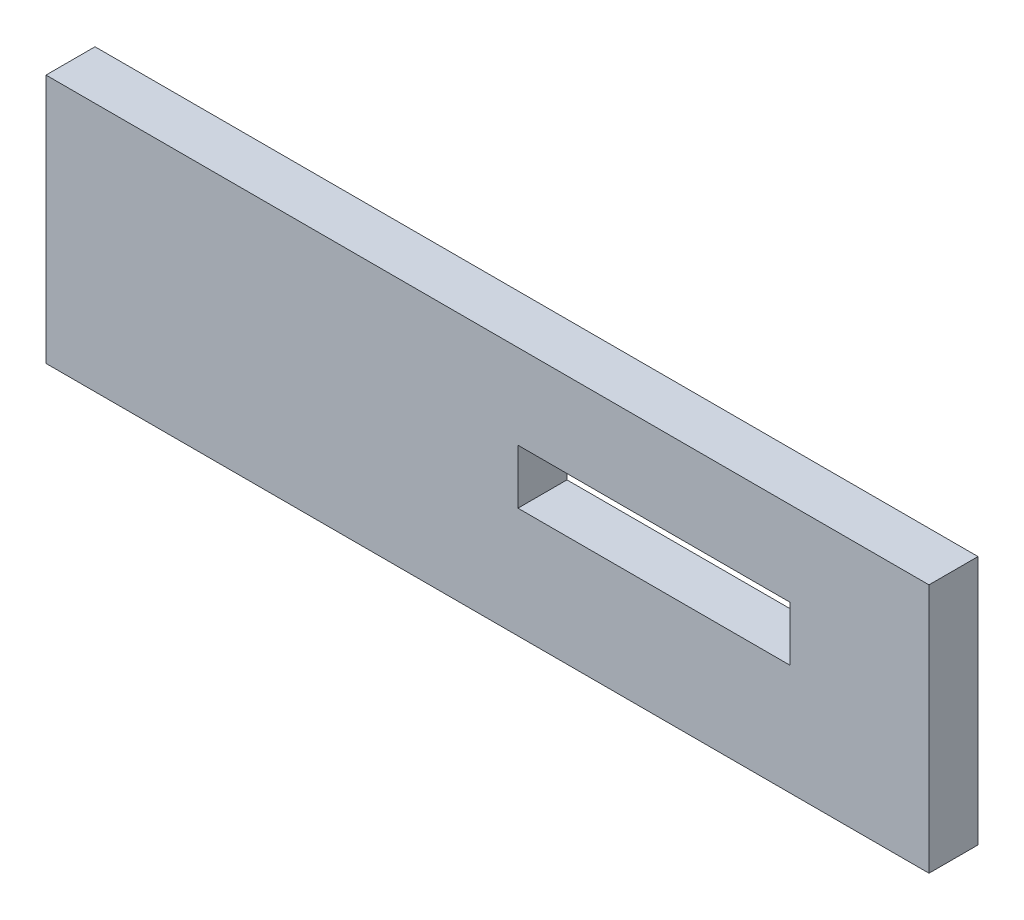
ISO-10303-21;
HEADER;
FILE_DESCRIPTION(('STEP AP214'),'2;1');
FILE_NAME('part.step','',(''),(''),'','','');
FILE_SCHEMA(('AUTOMOTIVE_DESIGN { 1 0 10303 214 1 1 1 1 }'));
ENDSEC;
DATA;
#1=APPLICATION_CONTEXT('core data for automotive mechanical design processes');
#2=APPLICATION_PROTOCOL_DEFINITION('international standard','automotive_design',2000,#1);
#3=PRODUCT_CONTEXT('',#1,'mechanical');
#4=PRODUCT('Part','Part','',(#3));
#5=PRODUCT_RELATED_PRODUCT_CATEGORY('part','',(#4));
#6=PRODUCT_DEFINITION_FORMATION('','',#4);
#7=PRODUCT_DEFINITION_CONTEXT('part definition',#1,'design');
#8=PRODUCT_DEFINITION('design','',#6,#7);
#9=PRODUCT_DEFINITION_SHAPE('','',#8);
#10=(LENGTH_UNIT() NAMED_UNIT(*) SI_UNIT(.MILLI.,.METRE.));
#11=(NAMED_UNIT(*) PLANE_ANGLE_UNIT() SI_UNIT($,.RADIAN.));
#12=(NAMED_UNIT(*) SI_UNIT($,.STERADIAN.) SOLID_ANGLE_UNIT());
#13=UNCERTAINTY_MEASURE_WITH_UNIT(LENGTH_MEASURE(1.E-05),#10,'distance_accuracy_value','');
#14=(GEOMETRIC_REPRESENTATION_CONTEXT(3) GLOBAL_UNCERTAINTY_ASSIGNED_CONTEXT((#13)) GLOBAL_UNIT_ASSIGNED_CONTEXT((#10,
#11,#12)) REPRESENTATION_CONTEXT('',''));
#15=CARTESIAN_POINT('',(0.,0.,0.));
#16=DIRECTION('',(0.,0.,1.));
#17=DIRECTION('',(1.,0.,0.));
#18=AXIS2_PLACEMENT_3D('',#15,#16,#17);
#19=CARTESIAN_POINT('',(0.,0.,0.));
#20=DIRECTION('',(0.,0.,1.));
#21=DIRECTION('',(1.,0.,0.));
#22=AXIS2_PLACEMENT_3D('',#19,#20,#21);
#23=PLANE('',#22);
#24=DIRECTION('',(1.,0.,0.));
#25=VECTOR('',#24,1.);
#26=CARTESIAN_POINT('',(0.,-1.45,0.));
#27=LINE('',#26,#25);
#28=CARTESIAN_POINT('',(-175.4419,-1.45,0.));
#29=VERTEX_POINT('',#28);
#30=CARTESIAN_POINT('',(-158.2419,-1.45,0.));
#31=VERTEX_POINT('',#30);
#32=EDGE_CURVE('E205',#29,#31,#27,.T.);
#33=ORIENTED_EDGE('',*,*,#32,.F.);
#34=DIRECTION('',(0.,-1.,0.));
#35=VECTOR('',#34,1.);
#36=CARTESIAN_POINT('',(-175.4419,0.,0.));
#37=LINE('',#36,#35);
#38=CARTESIAN_POINT('',(-175.4419,-4.9,0.));
#39=VERTEX_POINT('',#38);
#40=EDGE_CURVE('E214',#29,#39,#37,.T.);
#41=ORIENTED_EDGE('',*,*,#40,.T.);
#42=DIRECTION('',(1.,0.,0.));
#43=VECTOR('',#42,1.);
#44=CARTESIAN_POINT('',(0.,-4.9,0.));
#45=LINE('',#44,#43);
#46=CARTESIAN_POINT('',(-158.2419,-4.9,0.));
#47=VERTEX_POINT('',#46);
#48=EDGE_CURVE('E211',#39,#47,#45,.T.);
#49=ORIENTED_EDGE('',*,*,#48,.T.);
#50=DIRECTION('',(0.,-1.,0.));
#51=VECTOR('',#50,1.);
#52=CARTESIAN_POINT('',(-158.2419,0.,0.));
#53=LINE('',#52,#51);
#54=EDGE_CURVE('E208',#31,#47,#53,.T.);
#55=ORIENTED_EDGE('',*,*,#54,.F.);
#56=EDGE_LOOP('',(#33,#41,#49,#55));
#57=FACE_BOUND('',#56,.T.);
#58=CARTESIAN_POINT('',(-153.2419,-5.,0.));
#59=DIRECTION('',(0.,0.,1.));
#60=DIRECTION('',(1.,0.,0.));
#61=AXIS2_PLACEMENT_3D('',#58,#59,#60);
#62=CIRCLE('',#61,3.09999999999999);
#63=CARTESIAN_POINT('',(-150.1419,-5.,0.));
#64=VERTEX_POINT('',#63);
#65=EDGE_CURVE('E186',#64,#64,#62,.T.);
#66=ORIENTED_EDGE('',*,*,#65,.T.);
#67=EDGE_LOOP('',(#66));
#68=FACE_BOUND('',#67,.T.);
#69=CARTESIAN_POINT('',(-201.13739448131,-5.,0.));
#70=DIRECTION('',(0.,0.,1.));
#71=DIRECTION('',(1.,0.,0.));
#72=AXIS2_PLACEMENT_3D('',#69,#70,#71);
#73=CIRCLE('',#72,3.09999999999999);
#74=CARTESIAN_POINT('',(-198.03739448131,-5.,0.));
#75=VERTEX_POINT('',#74);
#76=EDGE_CURVE('E191',#75,#75,#73,.T.);
#77=ORIENTED_EDGE('',*,*,#76,.T.);
#78=EDGE_LOOP('',(#77));
#79=FACE_BOUND('',#78,.T.);
#80=DIRECTION('',(1.,0.,0.));
#81=VECTOR('',#80,1.);
#82=CARTESIAN_POINT('',(0.,-6.04928245513702,0.));
#83=LINE('',#82,#81);
#84=CARTESIAN_POINT('',(-194.74848896262,-6.049282455137,0.));
#85=VERTEX_POINT('',#84);
#86=CARTESIAN_POINT('',(-178.74848896262,-6.049282455137,0.));
#87=VERTEX_POINT('',#86);
#88=EDGE_CURVE('E159',#85,#87,#83,.T.);
#89=ORIENTED_EDGE('',*,*,#88,.T.);
#90=DIRECTION('',(0.,-1.,0.));
#91=VECTOR('',#90,1.);
#92=CARTESIAN_POINT('',(-178.74848896262,0.,0.));
#93=LINE('',#92,#91);
#94=CARTESIAN_POINT('',(-178.74848896262,0.450717544863003,0.));
#95=VERTEX_POINT('',#94);
#96=EDGE_CURVE('E167',#95,#87,#93,.T.);
#97=ORIENTED_EDGE('',*,*,#96,.F.);
#98=DIRECTION('',(1.,0.,0.));
#99=VECTOR('',#98,1.);
#100=CARTESIAN_POINT('',(0.,0.450717544863036,0.));
#101=LINE('',#100,#99);
#102=CARTESIAN_POINT('',(-194.74848896262,0.450717544863,0.));
#103=VERTEX_POINT('',#102);
#104=EDGE_CURVE('E169',#103,#95,#101,.T.);
#105=ORIENTED_EDGE('',*,*,#104,.F.);
#106=DIRECTION('',(0.,-1.,0.));
#107=VECTOR('',#106,1.);
#108=CARTESIAN_POINT('',(-194.74848896262,0.,0.));
#109=LINE('',#108,#107);
#110=EDGE_CURVE('E173',#103,#85,#109,.T.);
#111=ORIENTED_EDGE('',*,*,#110,.T.);
#112=EDGE_LOOP('',(#89,#97,#105,#111));
#113=FACE_BOUND('',#112,.T.);
#114=DIRECTION('',(-1.,0.,0.));
#115=VECTOR('',#114,1.);
#116=CARTESIAN_POINT('',(-205.29848896262,-11.9,0.));
#117=LINE('',#116,#115);
#118=CARTESIAN_POINT('',(-149.4419,-11.9,0.));
#119=VERTEX_POINT('',#118);
#120=CARTESIAN_POINT('',(-205.29848896262,-11.9,0.));
#121=VERTEX_POINT('',#120);
#122=EDGE_CURVE('E127',#119,#121,#117,.T.);
#123=ORIENTED_EDGE('',*,*,#122,.T.);
#124=DIRECTION('',(0.,1.,0.));
#125=VECTOR('',#124,1.);
#126=CARTESIAN_POINT('',(-205.29848896262,3.9,0.));
#127=LINE('',#126,#125);
#128=CARTESIAN_POINT('',(-205.29848896262,3.9,0.));
#129=VERTEX_POINT('',#128);
#130=EDGE_CURVE('E154',#121,#129,#127,.T.);
#131=ORIENTED_EDGE('',*,*,#130,.T.);
#132=DIRECTION('',(1.,0.,0.));
#133=VECTOR('',#132,1.);
#134=CARTESIAN_POINT('',(-205.29848896262,3.9,0.));
#135=LINE('',#134,#133);
#136=CARTESIAN_POINT('',(-149.4419,3.9,0.));
#137=VERTEX_POINT('',#136);
#138=EDGE_CURVE('E280',#129,#137,#135,.T.);
#139=ORIENTED_EDGE('',*,*,#138,.T.);
#140=DIRECTION('',(0.,-1.,0.));
#141=VECTOR('',#140,1.);
#142=CARTESIAN_POINT('',(-149.4419,3.9,0.));
#143=LINE('',#142,#141);
#144=EDGE_CURVE('E170',#137,#119,#143,.T.);
#145=ORIENTED_EDGE('',*,*,#144,.T.);
#146=EDGE_LOOP('',(#123,#131,#139,#145));
#147=FACE_BOUND('',#146,.T.);
#148=ADVANCED_FACE('F35',(#57,#68,#79,#113,#147),#23,.F.);
#149=CARTESIAN_POINT('',(0.,0.,3.10099735218397));
#150=DIRECTION('',(0.,0.,1.));
#151=DIRECTION('',(0.,-1.,0.));
#152=AXIS2_PLACEMENT_3D('',#149,#150,#151);
#153=PLANE('',#152);
#154=DIRECTION('',(0.,-1.,0.));
#155=VECTOR('',#154,1.);
#156=CARTESIAN_POINT('',(-175.4419,0.,3.10099735218401));
#157=LINE('',#156,#155);
#158=CARTESIAN_POINT('',(-175.4419,-1.45,3.10099735218401));
#159=VERTEX_POINT('',#158);
#160=CARTESIAN_POINT('',(-175.4419,-4.9,3.10099735218401));
#161=VERTEX_POINT('',#160);
#162=EDGE_CURVE('E11',#159,#161,#157,.T.);
#163=ORIENTED_EDGE('',*,*,#162,.F.);
#164=DIRECTION('',(1.,0.,0.));
#165=VECTOR('',#164,1.);
#166=CARTESIAN_POINT('',(0.,-1.45,3.10099735218397));
#167=LINE('',#166,#165);
#168=CARTESIAN_POINT('',(-158.2419,-1.45,3.10099735218401));
#169=VERTEX_POINT('',#168);
#170=EDGE_CURVE('E203',#159,#169,#167,.T.);
#171=ORIENTED_EDGE('',*,*,#170,.T.);
#172=DIRECTION('',(0.,-1.,0.));
#173=VECTOR('',#172,1.);
#174=CARTESIAN_POINT('',(-158.2419,0.,3.10099735218401));
#175=LINE('',#174,#173);
#176=CARTESIAN_POINT('',(-158.2419,-4.9,3.10099735218401));
#177=VERTEX_POINT('',#176);
#178=EDGE_CURVE('E201',#169,#177,#175,.T.);
#179=ORIENTED_EDGE('',*,*,#178,.T.);
#180=DIRECTION('',(1.,0.,0.));
#181=VECTOR('',#180,1.);
#182=CARTESIAN_POINT('',(0.,-4.9,3.10099735218397));
#183=LINE('',#182,#181);
#184=EDGE_CURVE('E190',#161,#177,#183,.T.);
#185=ORIENTED_EDGE('',*,*,#184,.F.);
#186=EDGE_LOOP('',(#163,#171,#179,#185));
#187=FACE_BOUND('',#186,.T.);
#188=DIRECTION('',(0.,-1.,0.));
#189=VECTOR('',#188,1.);
#190=CARTESIAN_POINT('',(-205.29848896262,3.9,3.10099735218397));
#191=LINE('',#190,#189);
#192=CARTESIAN_POINT('',(-205.29848896262,3.9,3.10099735218397));
#193=VERTEX_POINT('',#192);
#194=CARTESIAN_POINT('',(-205.29848896262,-11.9,3.10099735218403));
#195=VERTEX_POINT('',#194);
#196=EDGE_CURVE('E144',#193,#195,#191,.T.);
#197=ORIENTED_EDGE('',*,*,#196,.T.);
#198=DIRECTION('',(1.,0.,0.));
#199=VECTOR('',#198,1.);
#200=CARTESIAN_POINT('',(-205.29848896262,-11.9,3.10099735218397));
#201=LINE('',#200,#199);
#202=CARTESIAN_POINT('',(-149.4419,-11.9,3.10099735218397));
#203=VERTEX_POINT('',#202);
#204=EDGE_CURVE('E58',#195,#203,#201,.T.);
#205=ORIENTED_EDGE('',*,*,#204,.T.);
#206=DIRECTION('',(0.,1.,0.));
#207=VECTOR('',#206,1.);
#208=CARTESIAN_POINT('',(-149.4419,3.9,3.10099735218397));
#209=LINE('',#208,#207);
#210=CARTESIAN_POINT('',(-149.4419,3.9,3.10099735218397));
#211=VERTEX_POINT('',#210);
#212=EDGE_CURVE('E134',#203,#211,#209,.T.);
#213=ORIENTED_EDGE('',*,*,#212,.T.);
#214=DIRECTION('',(-1.,0.,0.));
#215=VECTOR('',#214,1.);
#216=CARTESIAN_POINT('',(-205.29848896262,3.9,3.10099735218397));
#217=LINE('',#216,#215);
#218=EDGE_CURVE('E140',#211,#193,#217,.T.);
#219=ORIENTED_EDGE('',*,*,#218,.T.);
#220=EDGE_LOOP('',(#197,#205,#213,#219));
#221=FACE_BOUND('',#220,.T.);
#222=ADVANCED_FACE('F143',(#187,#221),#153,.T.);
#223=CARTESIAN_POINT('',(-175.4419,0.,61.5886353768913));
#224=DIRECTION('',(1.,0.,0.));
#225=DIRECTION('',(0.,0.,-1.));
#226=AXIS2_PLACEMENT_3D('',#223,#224,#225);
#227=PLANE('',#226);
#228=DIRECTION('',(0.,0.,-1.));
#229=VECTOR('',#228,1.);
#230=CARTESIAN_POINT('',(-175.4419,-1.45,61.5886353768913));
#231=LINE('',#230,#229);
#232=EDGE_CURVE('E217',#159,#29,#231,.T.);
#233=ORIENTED_EDGE('',*,*,#232,.F.);
#234=ORIENTED_EDGE('',*,*,#162,.T.);
#235=DIRECTION('',(0.,0.,-1.));
#236=VECTOR('',#235,1.);
#237=CARTESIAN_POINT('',(-175.4419,-4.9,61.5886353768913));
#238=LINE('',#237,#236);
#239=EDGE_CURVE('E219',#161,#39,#238,.T.);
#240=ORIENTED_EDGE('',*,*,#239,.T.);
#241=ORIENTED_EDGE('',*,*,#40,.F.);
#242=EDGE_LOOP('',(#233,#234,#240,#241));
#243=FACE_BOUND('',#242,.T.);
#244=ADVANCED_FACE('F237',(#243),#227,.T.);
#245=CARTESIAN_POINT('',(0.,-4.9,61.5886353768913));
#246=DIRECTION('',(0.,1.,0.));
#247=DIRECTION('',(0.,0.,1.));
#248=AXIS2_PLACEMENT_3D('',#245,#246,#247);
#249=PLANE('',#248);
#250=ORIENTED_EDGE('',*,*,#239,.F.);
#251=ORIENTED_EDGE('',*,*,#184,.T.);
#252=DIRECTION('',(0.,0.,-1.));
#253=VECTOR('',#252,1.);
#254=CARTESIAN_POINT('',(-158.2419,-4.9,61.5886353768913));
#255=LINE('',#254,#253);
#256=EDGE_CURVE('E221',#177,#47,#255,.T.);
#257=ORIENTED_EDGE('',*,*,#256,.T.);
#258=ORIENTED_EDGE('',*,*,#48,.F.);
#259=EDGE_LOOP('',(#250,#251,#257,#258));
#260=FACE_BOUND('',#259,.T.);
#261=ADVANCED_FACE('F240',(#260),#249,.T.);
#262=CARTESIAN_POINT('',(-158.2419,0.,61.5886353768913));
#263=DIRECTION('',(1.,0.,0.));
#264=DIRECTION('',(0.,0.,-1.));
#265=AXIS2_PLACEMENT_3D('',#262,#263,#264);
#266=PLANE('',#265);
#267=ORIENTED_EDGE('',*,*,#178,.F.);
#268=DIRECTION('',(0.,0.,-1.));
#269=VECTOR('',#268,1.);
#270=CARTESIAN_POINT('',(-158.2419,-1.45,61.5886353768913));
#271=LINE('',#270,#269);
#272=EDGE_CURVE('E43',#169,#31,#271,.T.);
#273=ORIENTED_EDGE('',*,*,#272,.T.);
#274=ORIENTED_EDGE('',*,*,#54,.T.);
#275=ORIENTED_EDGE('',*,*,#256,.F.);
#276=EDGE_LOOP('',(#267,#273,#274,#275));
#277=FACE_BOUND('',#276,.T.);
#278=ADVANCED_FACE('F226',(#277),#266,.F.);
#279=CARTESIAN_POINT('',(0.,-1.45,61.5886353768913));
#280=DIRECTION('',(0.,1.,0.));
#281=DIRECTION('',(0.,0.,1.));
#282=AXIS2_PLACEMENT_3D('',#279,#280,#281);
#283=PLANE('',#282);
#284=ORIENTED_EDGE('',*,*,#170,.F.);
#285=ORIENTED_EDGE('',*,*,#232,.T.);
#286=ORIENTED_EDGE('',*,*,#32,.T.);
#287=ORIENTED_EDGE('',*,*,#272,.F.);
#288=EDGE_LOOP('',(#284,#285,#286,#287));
#289=FACE_BOUND('',#288,.T.);
#290=ADVANCED_FACE('F37',(#289),#283,.F.);
#291=CARTESIAN_POINT('',(-153.2419,-5.,3.05));
#292=DIRECTION('',(0.,0.,-1.));
#293=DIRECTION('',(-1.,0.,0.));
#294=AXIS2_PLACEMENT_3D('',#291,#292,#293);
#295=CYLINDRICAL_SURFACE('',#294,3.09999999999999);
#296=CARTESIAN_POINT('',(-153.2419,-5.,3.05));
#297=DIRECTION('',(0.,0.,1.));
#298=DIRECTION('',(1.,0.,0.));
#299=AXIS2_PLACEMENT_3D('',#296,#297,#298);
#300=CIRCLE('',#299,3.09999999999999);
#301=CARTESIAN_POINT('',(-150.1419,-5.,3.05));
#302=VERTEX_POINT('',#301);
#303=EDGE_CURVE('E194',#302,#302,#300,.T.);
#304=ORIENTED_EDGE('',*,*,#303,.T.);
#305=EDGE_LOOP('',(#304));
#306=FACE_BOUND('',#305,.T.);
#307=ORIENTED_EDGE('',*,*,#65,.F.);
#308=EDGE_LOOP('',(#307));
#309=FACE_BOUND('',#308,.T.);
#310=ADVANCED_FACE('F251',(#306,#309),#295,.F.);
#311=CARTESIAN_POINT('',(-153.2419,-5.,3.05));
#312=DIRECTION('',(0.,0.,1.));
#313=DIRECTION('',(1.,0.,0.));
#314=AXIS2_PLACEMENT_3D('',#311,#312,#313);
#315=PLANE('',#314);
#316=ORIENTED_EDGE('',*,*,#303,.F.);
#317=EDGE_LOOP('',(#316));
#318=FACE_BOUND('',#317,.T.);
#319=ADVANCED_FACE('F262',(#318),#315,.F.);
#320=CARTESIAN_POINT('',(-201.13739448131,-5.,3.05));
#321=DIRECTION('',(0.,0.,-1.));
#322=DIRECTION('',(-1.,0.,0.));
#323=AXIS2_PLACEMENT_3D('',#320,#321,#322);
#324=CYLINDRICAL_SURFACE('',#323,3.09999999999999);
#325=CARTESIAN_POINT('',(-201.13739448131,-5.,3.05));
#326=DIRECTION('',(0.,0.,1.));
#327=DIRECTION('',(1.,0.,0.));
#328=AXIS2_PLACEMENT_3D('',#325,#326,#327);
#329=CIRCLE('',#328,3.09999999999999);
#330=CARTESIAN_POINT('',(-198.03739448131,-5.,3.05));
#331=VERTEX_POINT('',#330);
#332=EDGE_CURVE('E187',#331,#331,#329,.T.);
#333=ORIENTED_EDGE('',*,*,#332,.T.);
#334=EDGE_LOOP('',(#333));
#335=FACE_BOUND('',#334,.T.);
#336=ORIENTED_EDGE('',*,*,#76,.F.);
#337=EDGE_LOOP('',(#336));
#338=FACE_BOUND('',#337,.T.);
#339=ADVANCED_FACE('F267',(#335,#338),#324,.F.);
#340=CARTESIAN_POINT('',(-201.13739448131,-5.,3.05));
#341=DIRECTION('',(0.,0.,1.));
#342=DIRECTION('',(1.,0.,0.));
#343=AXIS2_PLACEMENT_3D('',#340,#341,#342);
#344=PLANE('',#343);
#345=ORIENTED_EDGE('',*,*,#332,.F.);
#346=EDGE_LOOP('',(#345));
#347=FACE_BOUND('',#346,.T.);
#348=ADVANCED_FACE('F314',(#347),#344,.F.);
#349=CARTESIAN_POINT('',(-178.74848896262,0.,2.5));
#350=DIRECTION('',(1.,0.,0.));
#351=DIRECTION('',(0.,0.,-1.));
#352=AXIS2_PLACEMENT_3D('',#349,#350,#351);
#353=PLANE('',#352);
#354=ORIENTED_EDGE('',*,*,#96,.T.);
#355=DIRECTION('',(0.,0.,-1.));
#356=VECTOR('',#355,1.);
#357=CARTESIAN_POINT('',(-178.74848896262,-6.049282455137,2.5));
#358=LINE('',#357,#356);
#359=CARTESIAN_POINT('',(-178.74848896262,-6.049282455137,2.5));
#360=VERTEX_POINT('',#359);
#361=EDGE_CURVE('E166',#360,#87,#358,.T.);
#362=ORIENTED_EDGE('',*,*,#361,.F.);
#363=DIRECTION('',(0.,-1.,0.));
#364=VECTOR('',#363,1.);
#365=CARTESIAN_POINT('',(-178.74848896262,0.,2.5));
#366=LINE('',#365,#364);
#367=CARTESIAN_POINT('',(-178.74848896262,0.450717544863003,2.5));
#368=VERTEX_POINT('',#367);
#369=EDGE_CURVE('E155',#368,#360,#366,.T.);
#370=ORIENTED_EDGE('',*,*,#369,.F.);
#371=DIRECTION('',(0.,0.,-1.));
#372=VECTOR('',#371,1.);
#373=CARTESIAN_POINT('',(-178.74848896262,0.450717544863003,2.5));
#374=LINE('',#373,#372);
#375=EDGE_CURVE('E184',#368,#95,#374,.T.);
#376=ORIENTED_EDGE('',*,*,#375,.T.);
#377=EDGE_LOOP('',(#354,#362,#370,#376));
#378=FACE_BOUND('',#377,.T.);
#379=ADVANCED_FACE('F310',(#378),#353,.F.);
#380=CARTESIAN_POINT('',(0.,0.450717544863036,2.5));
#381=DIRECTION('',(0.,1.,0.));
#382=DIRECTION('',(-1.,0.,0.));
#383=AXIS2_PLACEMENT_3D('',#380,#381,#382);
#384=PLANE('',#383);
#385=ORIENTED_EDGE('',*,*,#104,.T.);
#386=ORIENTED_EDGE('',*,*,#375,.F.);
#387=DIRECTION('',(1.,0.,0.));
#388=VECTOR('',#387,1.);
#389=CARTESIAN_POINT('',(0.,0.450717544863036,2.5));
#390=LINE('',#389,#388);
#391=CARTESIAN_POINT('',(-194.74848896262,0.450717544863,2.5));
#392=VERTEX_POINT('',#391);
#393=EDGE_CURVE('E158',#392,#368,#390,.T.);
#394=ORIENTED_EDGE('',*,*,#393,.F.);
#395=DIRECTION('',(0.,0.,-1.));
#396=VECTOR('',#395,1.);
#397=CARTESIAN_POINT('',(-194.74848896262,0.450717544863,2.5));
#398=LINE('',#397,#396);
#399=EDGE_CURVE('E182',#392,#103,#398,.T.);
#400=ORIENTED_EDGE('',*,*,#399,.T.);
#401=EDGE_LOOP('',(#385,#386,#394,#400));
#402=FACE_BOUND('',#401,.T.);
#403=ADVANCED_FACE('F306',(#402),#384,.F.);
#404=CARTESIAN_POINT('',(-194.74848896262,0.,2.5));
#405=DIRECTION('',(1.,0.,0.));
#406=DIRECTION('',(0.,0.,-1.));
#407=AXIS2_PLACEMENT_3D('',#404,#405,#406);
#408=PLANE('',#407);
#409=ORIENTED_EDGE('',*,*,#110,.F.);
#410=ORIENTED_EDGE('',*,*,#399,.F.);
#411=DIRECTION('',(0.,-1.,0.));
#412=VECTOR('',#411,1.);
#413=CARTESIAN_POINT('',(-194.74848896262,0.,2.5));
#414=LINE('',#413,#412);
#415=CARTESIAN_POINT('',(-194.74848896262,-6.049282455137,2.5));
#416=VERTEX_POINT('',#415);
#417=EDGE_CURVE('E162',#392,#416,#414,.T.);
#418=ORIENTED_EDGE('',*,*,#417,.T.);
#419=DIRECTION('',(0.,0.,-1.));
#420=VECTOR('',#419,1.);
#421=CARTESIAN_POINT('',(-194.74848896262,-6.049282455137,2.5));
#422=LINE('',#421,#420);
#423=EDGE_CURVE('E180',#416,#85,#422,.T.);
#424=ORIENTED_EDGE('',*,*,#423,.T.);
#425=EDGE_LOOP('',(#409,#410,#418,#424));
#426=FACE_BOUND('',#425,.T.);
#427=ADVANCED_FACE('F302',(#426),#408,.T.);
#428=CARTESIAN_POINT('',(0.,-6.04928245513702,2.5));
#429=DIRECTION('',(0.,1.,0.));
#430=DIRECTION('',(-1.,0.,0.));
#431=AXIS2_PLACEMENT_3D('',#428,#429,#430);
#432=PLANE('',#431);
#433=ORIENTED_EDGE('',*,*,#88,.F.);
#434=ORIENTED_EDGE('',*,*,#423,.F.);
#435=DIRECTION('',(1.,0.,0.));
#436=VECTOR('',#435,1.);
#437=CARTESIAN_POINT('',(0.,-6.04928245513702,2.5));
#438=LINE('',#437,#436);
#439=EDGE_CURVE('E164',#416,#360,#438,.T.);
#440=ORIENTED_EDGE('',*,*,#439,.T.);
#441=ORIENTED_EDGE('',*,*,#361,.T.);
#442=EDGE_LOOP('',(#433,#434,#440,#441));
#443=FACE_BOUND('',#442,.T.);
#444=ADVANCED_FACE('F298',(#443),#432,.T.);
#445=CARTESIAN_POINT('',(0.,0.,2.5));
#446=DIRECTION('',(0.,0.,1.));
#447=DIRECTION('',(1.,0.,0.));
#448=AXIS2_PLACEMENT_3D('',#445,#446,#447);
#449=PLANE('',#448);
#450=ORIENTED_EDGE('',*,*,#369,.T.);
#451=ORIENTED_EDGE('',*,*,#439,.F.);
#452=ORIENTED_EDGE('',*,*,#417,.F.);
#453=ORIENTED_EDGE('',*,*,#393,.T.);
#454=EDGE_LOOP('',(#450,#451,#452,#453));
#455=FACE_BOUND('',#454,.T.);
#456=ADVANCED_FACE('F295',(#455),#449,.F.);
#457=CARTESIAN_POINT('',(-205.29848896262,-11.9,-58.4876380247073));
#458=DIRECTION('',(0.,-1.,0.));
#459=DIRECTION('',(0.,0.,-1.));
#460=AXIS2_PLACEMENT_3D('',#457,#458,#459);
#461=PLANE('',#460);
#462=DIRECTION('',(0.,0.,1.));
#463=VECTOR('',#462,1.);
#464=CARTESIAN_POINT('',(-149.4419,-11.9,-58.4876380247073));
#465=LINE('',#464,#463);
#466=EDGE_CURVE('E123',#119,#203,#465,.T.);
#467=ORIENTED_EDGE('',*,*,#466,.T.);
#468=ORIENTED_EDGE('',*,*,#204,.F.);
#469=DIRECTION('',(0.,0.,1.));
#470=VECTOR('',#469,1.);
#471=CARTESIAN_POINT('',(-205.29848896262,-11.9,-58.4876380247073));
#472=LINE('',#471,#470);
#473=EDGE_CURVE('E131',#121,#195,#472,.T.);
#474=ORIENTED_EDGE('',*,*,#473,.F.);
#475=ORIENTED_EDGE('',*,*,#122,.F.);
#476=EDGE_LOOP('',(#467,#468,#474,#475));
#477=FACE_BOUND('',#476,.T.);
#478=ADVANCED_FACE('F125',(#477),#461,.T.);
#479=CARTESIAN_POINT('',(-149.4419,3.9,-58.4876380247073));
#480=DIRECTION('',(1.,0.,0.));
#481=DIRECTION('',(0.,0.,-1.));
#482=AXIS2_PLACEMENT_3D('',#479,#480,#481);
#483=PLANE('',#482);
#484=DIRECTION('',(0.,0.,1.));
#485=VECTOR('',#484,1.);
#486=CARTESIAN_POINT('',(-149.4419,3.9,-58.4876380247073));
#487=LINE('',#486,#485);
#488=EDGE_CURVE('E130',#137,#211,#487,.T.);
#489=ORIENTED_EDGE('',*,*,#488,.T.);
#490=ORIENTED_EDGE('',*,*,#212,.F.);
#491=ORIENTED_EDGE('',*,*,#466,.F.);
#492=ORIENTED_EDGE('',*,*,#144,.F.);
#493=EDGE_LOOP('',(#489,#490,#491,#492));
#494=FACE_BOUND('',#493,.T.);
#495=ADVANCED_FACE('F135',(#494),#483,.T.);
#496=CARTESIAN_POINT('',(-205.29848896262,3.9,-58.4876380247073));
#497=DIRECTION('',(0.,1.,0.));
#498=DIRECTION('',(0.,0.,1.));
#499=AXIS2_PLACEMENT_3D('',#496,#497,#498);
#500=PLANE('',#499);
#501=DIRECTION('',(0.,0.,1.));
#502=VECTOR('',#501,1.);
#503=CARTESIAN_POINT('',(-205.29848896262,3.9,-58.4876380247073));
#504=LINE('',#503,#502);
#505=EDGE_CURVE('E50',#129,#193,#504,.T.);
#506=ORIENTED_EDGE('',*,*,#505,.T.);
#507=ORIENTED_EDGE('',*,*,#218,.F.);
#508=ORIENTED_EDGE('',*,*,#488,.F.);
#509=ORIENTED_EDGE('',*,*,#138,.F.);
#510=EDGE_LOOP('',(#506,#507,#508,#509));
#511=FACE_BOUND('',#510,.T.);
#512=ADVANCED_FACE('F284',(#511),#500,.T.);
#513=CARTESIAN_POINT('',(-205.29848896262,3.9,-58.4876380247073));
#514=DIRECTION('',(-1.,0.,0.));
#515=DIRECTION('',(0.,0.,1.));
#516=AXIS2_PLACEMENT_3D('',#513,#514,#515);
#517=PLANE('',#516);
#518=ORIENTED_EDGE('',*,*,#473,.T.);
#519=ORIENTED_EDGE('',*,*,#196,.F.);
#520=ORIENTED_EDGE('',*,*,#505,.F.);
#521=ORIENTED_EDGE('',*,*,#130,.F.);
#522=EDGE_LOOP('',(#518,#519,#520,#521));
#523=FACE_BOUND('',#522,.T.);
#524=ADVANCED_FACE('F285',(#523),#517,.T.);
#525=CLOSED_SHELL('',(#148,#222,#244,#261,#278,#290,#310,#319,#339,#348,#379,#403,#427,#444,
#456,#478,#495,#512,#524));
#526=MANIFOLD_SOLID_BREP('B2',#525);
#527=ADVANCED_BREP_SHAPE_REPRESENTATION('',(#18,#526),#14);
#528=SHAPE_DEFINITION_REPRESENTATION(#9,#527);
ENDSEC;
END-ISO-10303-21;
